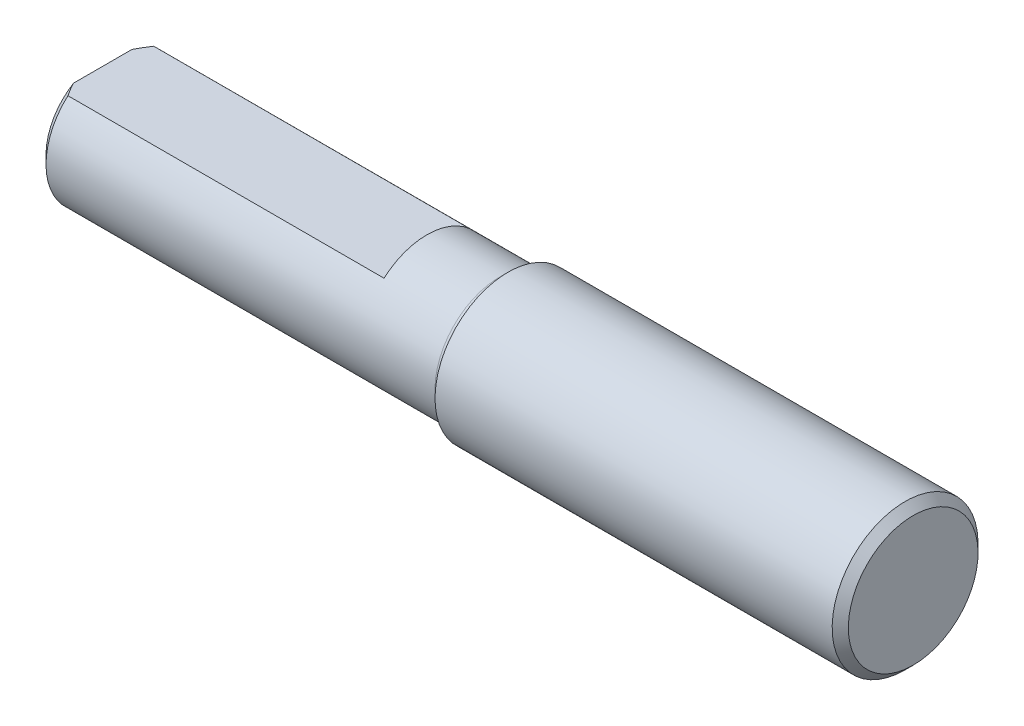
ISO-10303-21;
HEADER;
FILE_DESCRIPTION(('STEP AP214'),'2;1');
FILE_NAME('part.step','',(''),(''),'','','');
FILE_SCHEMA(('AUTOMOTIVE_DESIGN { 1 0 10303 214 1 1 1 1 }'));
ENDSEC;
DATA;
#1=APPLICATION_CONTEXT('core data for automotive mechanical design processes');
#2=APPLICATION_PROTOCOL_DEFINITION('international standard','automotive_design',2000,#1);
#3=PRODUCT_CONTEXT('',#1,'mechanical');
#4=PRODUCT('Part','Part','',(#3));
#5=PRODUCT_RELATED_PRODUCT_CATEGORY('part','',(#4));
#6=PRODUCT_DEFINITION_FORMATION('','',#4);
#7=PRODUCT_DEFINITION_CONTEXT('part definition',#1,'design');
#8=PRODUCT_DEFINITION('design','',#6,#7);
#9=PRODUCT_DEFINITION_SHAPE('','',#8);
#10=(LENGTH_UNIT() NAMED_UNIT(*) SI_UNIT(.MILLI.,.METRE.));
#11=(NAMED_UNIT(*) PLANE_ANGLE_UNIT() SI_UNIT($,.RADIAN.));
#12=(NAMED_UNIT(*) SI_UNIT($,.STERADIAN.) SOLID_ANGLE_UNIT());
#13=UNCERTAINTY_MEASURE_WITH_UNIT(LENGTH_MEASURE(1.E-05),#10,'distance_accuracy_value','');
#14=(GEOMETRIC_REPRESENTATION_CONTEXT(3) GLOBAL_UNCERTAINTY_ASSIGNED_CONTEXT((#13)) GLOBAL_UNIT_ASSIGNED_CONTEXT((#10,
#11,#12)) REPRESENTATION_CONTEXT('',''));
#15=CARTESIAN_POINT('',(0.,0.,0.));
#16=DIRECTION('',(0.,0.,1.));
#17=DIRECTION('',(1.,0.,0.));
#18=AXIS2_PLACEMENT_3D('',#15,#16,#17);
#19=CARTESIAN_POINT('',(-24.9999999999999,0.,0.));
#20=DIRECTION('',(0.999999999999998,0.,0.));
#21=DIRECTION('',(0.,1.,0.));
#22=AXIS2_PLACEMENT_3D('',#19,#20,#21);
#23=PLANE('',#22);
#24=CARTESIAN_POINT('',(-24.9999999999999,0.,0.));
#25=DIRECTION('',(-0.999999999999998,0.,0.));
#26=DIRECTION('',(0.,-1.,0.));
#27=AXIS2_PLACEMENT_3D('',#24,#25,#26);
#28=CIRCLE('',#27,3.50000000000006);
#29=CARTESIAN_POINT('',(-24.9999999999999,3.00000000000003,-1.80277563773157));
#30=VERTEX_POINT('',#29);
#31=CARTESIAN_POINT('',(-24.9999999999999,3.00000000000003,1.80277563773246));
#32=VERTEX_POINT('',#31);
#33=EDGE_CURVE('E86',#30,#32,#28,.T.);
#34=ORIENTED_EDGE('',*,*,#33,.T.);
#35=DIRECTION('',(0.,0.,0.999999999999998));
#36=VECTOR('',#35,1.);
#37=CARTESIAN_POINT('',(-24.9999999999999,3.00000000000003,-2.64575131106415));
#38=LINE('',#37,#36);
#39=EDGE_CURVE('E75',#30,#32,#38,.T.);
#40=ORIENTED_EDGE('',*,*,#39,.F.);
#41=EDGE_LOOP('',(#34,#40));
#42=FACE_BOUND('',#41,.T.);
#43=ADVANCED_FACE('F34',(#42),#23,.F.);
#44=CARTESIAN_POINT('',(24.9999999999992,0.,0.));
#45=DIRECTION('',(-0.999999999999998,0.,0.));
#46=DIRECTION('',(0.,-1.,0.));
#47=AXIS2_PLACEMENT_3D('',#44,#45,#46);
#48=PLANE('',#47);
#49=CARTESIAN_POINT('',(24.9999999999993,0.,0.));
#50=DIRECTION('',(-0.999999999999998,0.,0.));
#51=DIRECTION('',(0.,-1.,0.));
#52=AXIS2_PLACEMENT_3D('',#49,#50,#51);
#53=CIRCLE('',#52,4.00000000000017);
#54=CARTESIAN_POINT('',(24.9999999999993,-4.00000000000023,0.));
#55=VERTEX_POINT('',#54);
#56=EDGE_CURVE('E101',#55,#55,#53,.T.);
#57=ORIENTED_EDGE('',*,*,#56,.F.);
#58=EDGE_LOOP('',(#57));
#59=FACE_BOUND('',#58,.T.);
#60=ADVANCED_FACE('F111',(#59),#48,.F.);
#61=CARTESIAN_POINT('',(24.9999999999993,0.,0.));
#62=DIRECTION('',(-0.999999999999998,0.,0.));
#63=DIRECTION('',(0.,-1.,0.));
#64=AXIS2_PLACEMENT_3D('',#61,#62,#63);
#65=CONICAL_SURFACE('',#64,4.00000000000017,0.785398163397447);
#66=CARTESIAN_POINT('',(24.4999999999992,0.,0.));
#67=DIRECTION('',(-0.999999999999998,0.,0.));
#68=DIRECTION('',(0.,-1.,0.));
#69=AXIS2_PLACEMENT_3D('',#66,#67,#68);
#70=CIRCLE('',#69,4.50000000000023);
#71=CARTESIAN_POINT('',(24.4999999999992,-4.50000000000028,0.));
#72=VERTEX_POINT('',#71);
#73=EDGE_CURVE('E99',#72,#72,#70,.T.);
#74=CARTESIAN_POINT('',(24.4999999999992,-4.50000000000028,0.));
#75=CARTESIAN_POINT('',(24.5052083333326,-4.49479166666695,0.));
#76=CARTESIAN_POINT('',(24.5104166666659,-4.48958333333362,0.));
#77=CARTESIAN_POINT('',(24.5208333333326,-4.47916666666695,0.));
#78=CARTESIAN_POINT('',(24.5260416666659,-4.47395833333361,0.));
#79=CARTESIAN_POINT('',(24.5364583333326,-4.46354166666694,0.));
#80=CARTESIAN_POINT('',(24.5416666666659,-4.45833333333361,0.));
#81=CARTESIAN_POINT('',(24.5520833333326,-4.44791666666694,0.));
#82=CARTESIAN_POINT('',(24.5572916666659,-4.44270833333361,0.));
#83=CARTESIAN_POINT('',(24.5677083333326,-4.43229166666694,0.));
#84=CARTESIAN_POINT('',(24.5729166666659,-4.42708333333361,0.));
#85=CARTESIAN_POINT('',(24.5833333333326,-4.41666666666694,0.));
#86=CARTESIAN_POINT('',(24.5885416666659,-4.41145833333361,0.));
#87=CARTESIAN_POINT('',(24.5989583333326,-4.40104166666694,0.));
#88=CARTESIAN_POINT('',(24.6041666666659,-4.3958333333336,0.));
#89=CARTESIAN_POINT('',(24.6145833333326,-4.38541666666694,0.));
#90=CARTESIAN_POINT('',(24.6197916666659,-4.3802083333336,0.));
#91=CARTESIAN_POINT('',(24.6302083333326,-4.36979166666694,0.));
#92=CARTESIAN_POINT('',(24.6354166666659,-4.3645833333336,0.));
#93=CARTESIAN_POINT('',(24.6458333333326,-4.35416666666693,0.));
#94=CARTESIAN_POINT('',(24.6510416666659,-4.3489583333336,0.));
#95=CARTESIAN_POINT('',(24.6614583333326,-4.33854166666693,0.));
#96=CARTESIAN_POINT('',(24.6666666666659,-4.3333333333336,0.));
#97=CARTESIAN_POINT('',(24.6770833333326,-4.32291666666693,0.));
#98=CARTESIAN_POINT('',(24.6822916666659,-4.3177083333336,0.));
#99=CARTESIAN_POINT('',(24.6927083333326,-4.30729166666693,0.));
#100=CARTESIAN_POINT('',(24.6979166666659,-4.3020833333336,0.));
#101=CARTESIAN_POINT('',(24.7083333333326,-4.29166666666693,0.));
#102=CARTESIAN_POINT('',(24.7135416666659,-4.28645833333359,0.));
#103=CARTESIAN_POINT('',(24.7239583333326,-4.27604166666692,0.));
#104=CARTESIAN_POINT('',(24.7291666666659,-4.27083333333359,0.));
#105=CARTESIAN_POINT('',(24.7395833333326,-4.26041666666692,0.));
#106=CARTESIAN_POINT('',(24.7447916666659,-4.25520833333359,0.));
#107=CARTESIAN_POINT('',(24.7552083333326,-4.24479166666692,0.));
#108=CARTESIAN_POINT('',(24.7604166666659,-4.23958333333359,0.));
#109=CARTESIAN_POINT('',(24.7708333333326,-4.22916666666692,0.));
#110=CARTESIAN_POINT('',(24.7760416666659,-4.22395833333359,0.));
#111=CARTESIAN_POINT('',(24.7864583333326,-4.21354166666692,0.));
#112=CARTESIAN_POINT('',(24.7916666666659,-4.20833333333358,0.));
#113=CARTESIAN_POINT('',(24.8020833333326,-4.19791666666692,0.));
#114=CARTESIAN_POINT('',(24.8072916666659,-4.19270833333358,0.));
#115=CARTESIAN_POINT('',(24.8177083333326,-4.18229166666691,0.));
#116=CARTESIAN_POINT('',(24.8229166666659,-4.17708333333358,0.));
#117=CARTESIAN_POINT('',(24.8333333333326,-4.16666666666691,0.));
#118=CARTESIAN_POINT('',(24.8385416666659,-4.16145833333358,0.));
#119=CARTESIAN_POINT('',(24.8489583333326,-4.15104166666691,0.));
#120=CARTESIAN_POINT('',(24.8541666666659,-4.14583333333358,0.));
#121=CARTESIAN_POINT('',(24.8645833333326,-4.13541666666691,0.));
#122=CARTESIAN_POINT('',(24.8697916666659,-4.13020833333357,0.));
#123=CARTESIAN_POINT('',(24.8802083333326,-4.11979166666691,0.));
#124=CARTESIAN_POINT('',(24.8854166666659,-4.11458333333357,0.));
#125=CARTESIAN_POINT('',(24.8958333333326,-4.10416666666691,0.));
#126=CARTESIAN_POINT('',(24.9010416666659,-4.09895833333357,0.));
#127=CARTESIAN_POINT('',(24.9114583333326,-4.0885416666669,0.));
#128=CARTESIAN_POINT('',(24.9166666666659,-4.08333333333357,0.));
#129=CARTESIAN_POINT('',(24.9270833333326,-4.0729166666669,0.));
#130=CARTESIAN_POINT('',(24.9322916666659,-4.06770833333357,0.));
#131=CARTESIAN_POINT('',(24.9427083333326,-4.0572916666669,0.));
#132=CARTESIAN_POINT('',(24.9479166666659,-4.05208333333357,0.));
#133=CARTESIAN_POINT('',(24.9583333333326,-4.0416666666669,0.));
#134=CARTESIAN_POINT('',(24.9635416666659,-4.03645833333356,0.));
#135=CARTESIAN_POINT('',(24.9739583333326,-4.0260416666669,0.));
#136=CARTESIAN_POINT('',(24.9791666666659,-4.02083333333356,0.));
#137=CARTESIAN_POINT('',(24.9895833333326,-4.0104166666669,0.));
#138=CARTESIAN_POINT('',(24.9947916666659,-4.00520833333356,0.));
#139=CARTESIAN_POINT('',(24.9999999999993,-4.00000000000023,0.));
#140=B_SPLINE_CURVE_WITH_KNOTS('',3,(#74,#75,#76,#77,#78,#79,#80,#81,#82,#83,#84,#85,#86,#87,
#88,#89,#90,#91,#92,#93,#94,#95,#96,#97,#98,#99,#100,#101,#102,#103,#104,#105,#106,#107,#108,
#109,#110,#111,#112,#113,#114,#115,#116,#117,#118,#119,#120,#121,#122,#123,#124,#125,#126,#127,
#128,#129,#130,#131,#132,#133,#134,#135,#136,#137,#138,#139),.UNSPECIFIED.,.F.,.F.,(4,2,2,2,2,2,
2,2,2,2,2,2,2,2,2,2,2,2,2,2,2,2,2,2,2,2,2,2,2,2,2,2,4),(0.,0.0220970869120845,
0.0441941738241642,0.0662912607362487,0.0883883476483283,0.110485434560413,0.132582521472492,
0.154679608384577,0.176776695296656,0.198873782208741,0.22097086912082,0.243067956032905,
0.265165042944984,0.287262129857069,0.309359216769149,0.331456303681233,0.353553390593313,
0.375650477505395,0.397747564417477,0.419844651329561,0.441941738241641,0.464038825153723,
0.486135912065805,0.50823299897789,0.530330085889969,0.552427172802052,0.574524259714134,
0.596621346626218,0.618718433538298,0.64081552045038,0.662912607362462,0.685009694274547,
0.707106781186629),.UNSPECIFIED.);
#141=EDGE_CURVE('BSEAM115',#72,#55,#140,.T.);
#142=ORIENTED_EDGE('',*,*,#73,.F.);
#143=ORIENTED_EDGE('',*,*,#56,.T.);
#144=ORIENTED_EDGE('',*,*,#141,.T.);
#145=ORIENTED_EDGE('',*,*,#141,.F.);
#146=EDGE_LOOP('',(#142,#144,#143,#145));
#147=FACE_BOUND('',#146,.T.);
#148=ADVANCED_FACE('F115',(#147),#65,.T.);
#149=CARTESIAN_POINT('',(-24.9999999999999,0.,0.));
#150=DIRECTION('',(-0.999999999999998,0.,0.));
#151=DIRECTION('',(0.,-1.,0.));
#152=AXIS2_PLACEMENT_3D('',#149,#150,#151);
#153=CYLINDRICAL_SURFACE('',#152,4.50000000000021);
#154=CARTESIAN_POINT('',(1.11022302462516E-13,0.,0.));
#155=DIRECTION('',(-0.999999999999998,0.,0.));
#156=DIRECTION('',(0.,-1.,0.));
#157=AXIS2_PLACEMENT_3D('',#154,#155,#156);
#158=CIRCLE('',#157,4.5000000000002);
#159=CARTESIAN_POINT('',(1.04083408558608E-13,-4.50000000000024,0.));
#160=VERTEX_POINT('',#159);
#161=EDGE_CURVE('E96',#160,#160,#158,.T.);
#162=CARTESIAN_POINT('',(1.04083408558608E-13,-4.50000000000024,0.));
#163=CARTESIAN_POINT('',(0.255208333333429,-4.50000000000024,0.));
#164=CARTESIAN_POINT('',(0.510416666666754,-4.50000000000024,0.));
#165=CARTESIAN_POINT('',(1.0208333333334,-4.50000000000024,0.));
#166=CARTESIAN_POINT('',(1.27604166666673,-4.50000000000024,0.));
#167=CARTESIAN_POINT('',(1.78645833333337,-4.50000000000024,0.));
#168=CARTESIAN_POINT('',(2.0416666666667,-4.50000000000024,0.));
#169=CARTESIAN_POINT('',(2.55208333333335,-4.50000000000024,0.));
#170=CARTESIAN_POINT('',(2.80729166666667,-4.50000000000024,0.));
#171=CARTESIAN_POINT('',(3.31770833333332,-4.50000000000024,0.));
#172=CARTESIAN_POINT('',(3.57291666666664,-4.50000000000024,0.));
#173=CARTESIAN_POINT('',(4.08333333333329,-4.50000000000024,0.));
#174=CARTESIAN_POINT('',(4.33854166666661,-4.50000000000025,0.));
#175=CARTESIAN_POINT('',(4.84895833333326,-4.50000000000025,0.));
#176=CARTESIAN_POINT('',(5.10416666666659,-4.50000000000025,0.));
#177=CARTESIAN_POINT('',(5.61458333333323,-4.50000000000025,0.));
#178=CARTESIAN_POINT('',(5.86979166666656,-4.50000000000025,0.));
#179=CARTESIAN_POINT('',(6.38020833333321,-4.50000000000025,0.));
#180=CARTESIAN_POINT('',(6.63541666666653,-4.50000000000025,0.));
#181=CARTESIAN_POINT('',(7.14583333333318,-4.50000000000025,0.));
#182=CARTESIAN_POINT('',(7.40104166666651,-4.50000000000025,0.));
#183=CARTESIAN_POINT('',(7.91145833333315,-4.50000000000025,0.));
#184=CARTESIAN_POINT('',(8.16666666666648,-4.50000000000025,0.));
#185=CARTESIAN_POINT('',(8.67708333333312,-4.50000000000025,0.));
#186=CARTESIAN_POINT('',(8.93229166666644,-4.50000000000025,0.));
#187=CARTESIAN_POINT('',(9.44270833333309,-4.50000000000025,0.));
#188=CARTESIAN_POINT('',(9.69791666666642,-4.50000000000025,0.));
#189=CARTESIAN_POINT('',(10.2083333333331,-4.50000000000025,0.));
#190=CARTESIAN_POINT('',(10.4635416666664,-4.50000000000025,0.));
#191=CARTESIAN_POINT('',(10.973958333333,-4.50000000000025,0.));
#192=CARTESIAN_POINT('',(11.2291666666664,-4.50000000000025,0.));
#193=CARTESIAN_POINT('',(11.739583333333,-4.50000000000025,0.));
#194=CARTESIAN_POINT('',(11.9947916666663,-4.50000000000025,0.));
#195=CARTESIAN_POINT('',(12.505208333333,-4.50000000000025,0.));
#196=CARTESIAN_POINT('',(12.7604166666663,-4.50000000000025,0.));
#197=CARTESIAN_POINT('',(13.270833333333,-4.50000000000025,0.));
#198=CARTESIAN_POINT('',(13.5260416666663,-4.50000000000026,0.));
#199=CARTESIAN_POINT('',(14.0364583333329,-4.50000000000026,0.));
#200=CARTESIAN_POINT('',(14.2916666666663,-4.50000000000026,0.));
#201=CARTESIAN_POINT('',(14.8020833333329,-4.50000000000026,0.));
#202=CARTESIAN_POINT('',(15.0572916666662,-4.50000000000026,0.));
#203=CARTESIAN_POINT('',(15.5677083333329,-4.50000000000026,0.));
#204=CARTESIAN_POINT('',(15.8229166666662,-4.50000000000026,0.));
#205=CARTESIAN_POINT('',(16.3333333333328,-4.50000000000026,0.));
#206=CARTESIAN_POINT('',(16.5885416666662,-4.50000000000026,0.));
#207=CARTESIAN_POINT('',(17.0989583333328,-4.50000000000026,0.));
#208=CARTESIAN_POINT('',(17.3541666666661,-4.50000000000026,0.));
#209=CARTESIAN_POINT('',(17.8645833333328,-4.50000000000026,0.));
#210=CARTESIAN_POINT('',(18.1197916666661,-4.50000000000026,0.));
#211=CARTESIAN_POINT('',(18.6302083333328,-4.50000000000026,0.));
#212=CARTESIAN_POINT('',(18.8854166666661,-4.50000000000026,0.));
#213=CARTESIAN_POINT('',(19.3958333333327,-4.50000000000026,0.));
#214=CARTESIAN_POINT('',(19.6510416666661,-4.50000000000026,0.));
#215=CARTESIAN_POINT('',(20.1614583333327,-4.50000000000026,0.));
#216=CARTESIAN_POINT('',(20.416666666666,-4.50000000000026,0.));
#217=CARTESIAN_POINT('',(20.9270833333327,-4.50000000000026,0.));
#218=CARTESIAN_POINT('',(21.182291666666,-4.50000000000026,0.));
#219=CARTESIAN_POINT('',(21.6927083333327,-4.50000000000026,0.));
#220=CARTESIAN_POINT('',(21.947916666666,-4.50000000000026,0.));
#221=CARTESIAN_POINT('',(22.4583333333326,-4.50000000000026,0.));
#222=CARTESIAN_POINT('',(22.713541666666,-4.50000000000026,0.));
#223=CARTESIAN_POINT('',(23.2239583333326,-4.50000000000026,0.));
#224=CARTESIAN_POINT('',(23.4791666666659,-4.50000000000027,0.));
#225=CARTESIAN_POINT('',(23.9895833333326,-4.50000000000027,0.));
#226=CARTESIAN_POINT('',(24.2447916666659,-4.50000000000027,0.));
#227=CARTESIAN_POINT('',(24.4999999999992,-4.50000000000027,0.));
#228=B_SPLINE_CURVE_WITH_KNOTS('',3,(#162,#163,#164,#165,#166,#167,#168,#169,#170,#171,#172,
#173,#174,#175,#176,#177,#178,#179,#180,#181,#182,#183,#184,#185,#186,#187,#188,#189,#190,#191,
#192,#193,#194,#195,#196,#197,#198,#199,#200,#201,#202,#203,#204,#205,#206,#207,#208,#209,#210,
#211,#212,#213,#214,#215,#216,#217,#218,#219,#220,#221,#222,#223,#224,#225,#226,#227),
.UNSPECIFIED.,.F.,.F.,(4,2,2,2,2,2,2,2,2,2,2,2,2,2,2,2,2,2,2,2,2,2,2,2,2,2,2,2,2,2,2,2,4),(0.,
0.765624999999975,1.53124999999995,2.29687499999992,3.06249999999989,3.82812499999986,
4.59374999999983,5.35937499999981,6.12499999999978,6.89062499999975,7.65624999999973,
8.42187499999969,9.18749999999966,9.95312499999964,10.7187499999996,11.4843749999996,
12.2499999999996,13.0156249999995,13.7812499999995,14.5468749999995,15.3124999999995,
16.0781249999994,16.8437499999994,17.6093749999994,18.3749999999993,19.1406249999993,
19.9062499999993,20.6718749999993,21.4374999999992,22.2031249999992,22.9687499999992,
23.7343749999991,24.4999999999991),.UNSPECIFIED.);
#229=EDGE_CURVE('BSEAM120',#160,#72,#228,.T.);
#230=ORIENTED_EDGE('',*,*,#161,.F.);
#231=ORIENTED_EDGE('',*,*,#73,.T.);
#232=ORIENTED_EDGE('',*,*,#229,.T.);
#233=ORIENTED_EDGE('',*,*,#229,.F.);
#234=EDGE_LOOP('',(#230,#232,#231,#233));
#235=FACE_BOUND('',#234,.T.);
#236=ADVANCED_FACE('F120',(#235),#153,.T.);
#237=CARTESIAN_POINT('',(-0.499999999999612,0.,0.));
#238=DIRECTION('',(-0.999999999999998,0.,0.));
#239=DIRECTION('',(0.,-1.,0.));
#240=AXIS2_PLACEMENT_3D('',#237,#238,#239);
#241=TOROIDAL_SURFACE('',#240,4.49999999999961,0.499999999999542);
#242=CARTESIAN_POINT('',(-0.499999999999723,0.,0.));
#243=DIRECTION('',(-0.999999999999998,0.,0.));
#244=DIRECTION('',(0.,-1.,0.));
#245=AXIS2_PLACEMENT_3D('',#242,#243,#244);
#246=CIRCLE('',#245,4.00000000000007);
#247=CARTESIAN_POINT('',(-0.499999999999727,-4.0000000000001,0.));
#248=VERTEX_POINT('',#247);
#249=EDGE_CURVE('E93',#248,#248,#246,.T.);
#250=ORIENTED_EDGE('',*,*,#249,.F.);
#251=EDGE_LOOP('',(#250));
#252=FACE_BOUND('',#251,.T.);
#253=ORIENTED_EDGE('',*,*,#161,.T.);
#254=EDGE_LOOP('',(#253));
#255=FACE_BOUND('',#254,.T.);
#256=ADVANCED_FACE('F126',(#252,#255),#241,.F.);
#257=CARTESIAN_POINT('',(-24.9999999999999,0.,0.));
#258=DIRECTION('',(-0.999999999999998,0.,0.));
#259=DIRECTION('',(0.,-1.,0.));
#260=AXIS2_PLACEMENT_3D('',#257,#258,#259);
#261=CYLINDRICAL_SURFACE('',#260,4.00000000000004);
#262=CARTESIAN_POINT('',(-4.99999999999989,0.,0.));
#263=DIRECTION('',(-0.999999999999998,0.,0.));
#264=DIRECTION('',(0.,-1.,0.));
#265=AXIS2_PLACEMENT_3D('',#262,#263,#264);
#266=CIRCLE('',#265,3.99999999999998);
#267=CARTESIAN_POINT('',(-4.99999999999991,3.00000000000001,2.64575131106459));
#268=VERTEX_POINT('',#267);
#269=CARTESIAN_POINT('',(-4.99999999999991,3.00000000000001,-2.64575131106415));
#270=VERTEX_POINT('',#269);
#271=EDGE_CURVE('E71',#268,#270,#266,.T.);
#272=ORIENTED_EDGE('',*,*,#271,.F.);
#273=DIRECTION('',(-0.999999999999998,0.,0.));
#274=VECTOR('',#273,1.);
#275=CARTESIAN_POINT('',(-4.99999999999991,3.00000000000001,2.64575131106459));
#276=LINE('',#275,#274);
#277=CARTESIAN_POINT('',(-24.4999999999997,3.00000000000003,2.64575131106459));
#278=VERTEX_POINT('',#277);
#279=EDGE_CURVE('E78',#268,#278,#276,.T.);
#280=ORIENTED_EDGE('',*,*,#279,.T.);
#281=CARTESIAN_POINT('',(-24.4999999999997,0.,0.));
#282=DIRECTION('',(-0.999999999999998,0.,0.));
#283=DIRECTION('',(0.,-1.,0.));
#284=AXIS2_PLACEMENT_3D('',#281,#282,#283);
#285=CIRCLE('',#284,4.);
#286=CARTESIAN_POINT('',(-24.4999999999997,3.00000000000003,-2.64575131106415));
#287=VERTEX_POINT('',#286);
#288=EDGE_CURVE('E84',#287,#278,#285,.T.);
#289=ORIENTED_EDGE('',*,*,#288,.F.);
#290=DIRECTION('',(-0.999999999999998,0.,0.));
#291=VECTOR('',#290,1.);
#292=CARTESIAN_POINT('',(-4.99999999999991,3.00000000000001,-2.64575131106415));
#293=LINE('',#292,#291);
#294=EDGE_CURVE('E53',#270,#287,#293,.T.);
#295=ORIENTED_EDGE('',*,*,#294,.F.);
#296=EDGE_LOOP('',(#272,#280,#289,#295));
#297=FACE_BOUND('',#296,.T.);
#298=ORIENTED_EDGE('',*,*,#249,.T.);
#299=EDGE_LOOP('',(#298));
#300=FACE_BOUND('',#299,.T.);
#301=ADVANCED_FACE('F81',(#297,#300),#261,.T.);
#302=CARTESIAN_POINT('',(-24.4999999999997,0.,0.));
#303=DIRECTION('',(0.999999999999998,0.,0.));
#304=DIRECTION('',(0.,1.,0.));
#305=AXIS2_PLACEMENT_3D('',#302,#303,#304);
#306=CONICAL_SURFACE('',#305,4.,0.785398163397227);
#307=ORIENTED_EDGE('',*,*,#288,.T.);
#308=CARTESIAN_POINT('',(-21.9389659892247,3.00000000000002,5.83499505488538));
#309=CARTESIAN_POINT('',(-22.0903757892768,3.00000000000002,5.66468696293585));
#310=CARTESIAN_POINT('',(-22.2410727937851,3.00000000000002,5.49373335194589));
#311=CARTESIAN_POINT('',(-22.5405200919097,3.00000000000002,5.15001939532114));
#312=CARTESIAN_POINT('',(-22.6892696392174,3.00000000000002,4.97725840019569));
#313=CARTESIAN_POINT('',(-22.9861622529166,3.00000000000003,4.62721157591021));
#314=CARTESIAN_POINT('',(-23.1342705110427,3.00000000000003,4.44989613430255));
#315=CARTESIAN_POINT('',(-23.4268634474958,3.00000000000002,4.09234737889281));
#316=CARTESIAN_POINT('',(-23.5713488711189,3.00000000000001,3.9121146779992));
#317=CARTESIAN_POINT('',(-23.848485578707,3.00000000000001,3.55645961437265));
#318=CARTESIAN_POINT('',(-23.9813720744665,3.00000000000002,3.38122119667286));
#319=CARTESIAN_POINT('',(-24.2407715989189,3.00000000000003,3.02586564459339));
#320=CARTESIAN_POINT('',(-24.367280814457,3.00000000000003,2.84574568808456));
#321=CARTESIAN_POINT('',(-24.5496072378903,3.00000000000003,2.57103616471239));
#322=CARTESIAN_POINT('',(-24.6090558718556,3.00000000000003,2.4788592059635));
#323=CARTESIAN_POINT('',(-24.7249614937987,3.00000000000003,2.29264891488516));
#324=CARTESIAN_POINT('',(-24.7814188465766,3.00000000000003,2.1986158108496));
#325=CARTESIAN_POINT('',(-24.8905659215351,3.00000000000003,2.00849807496143));
#326=CARTESIAN_POINT('',(-24.9432592711017,3.00000000000003,1.91241553739272));
#327=CARTESIAN_POINT('',(-25.043980962702,3.00000000000003,1.71784609768047));
#328=CARTESIAN_POINT('',(-25.0920104978542,3.00000000000003,1.61935981858356));
#329=CARTESIAN_POINT('',(-25.1790019774935,3.00000000000003,1.42683682628257));
#330=CARTESIAN_POINT('',(-25.2183662352772,3.00000000000003,1.33298336568668));
#331=CARTESIAN_POINT('',(-25.2908795476152,3.00000000000003,1.14287816274652));
#332=CARTESIAN_POINT('',(-25.3240286409686,3.00000000000003,1.04662643537812));
#333=CARTESIAN_POINT('',(-25.3826486518212,3.00000000000003,0.852297204493808));
#334=CARTESIAN_POINT('',(-25.4081565505998,3.00000000000003,0.754231016372685));
#335=CARTESIAN_POINT('',(-25.4504005055913,3.00000000000003,0.556235100211649));
#336=CARTESIAN_POINT('',(-25.4671399623641,3.00000000000003,0.456306110193535));
#337=CARTESIAN_POINT('',(-25.4909810916825,3.00000000000003,0.253836760287375));
#338=CARTESIAN_POINT('',(-25.4979421404768,3.00000000000003,0.15127947755912));
#339=CARTESIAN_POINT('',(-25.5012693591199,3.00000000000003,-0.0540034437542772));
#340=CARTESIAN_POINT('',(-25.4976361757776,3.00000000000003,-0.156729071678753));
#341=CARTESIAN_POINT('',(-25.4800191738947,3.00000000000003,-0.361571241378228));
#342=CARTESIAN_POINT('',(-25.4660054383061,3.00000000000003,-0.463685160952634));
#343=CARTESIAN_POINT('',(-25.4285425687726,3.00000000000003,-0.666157326790062));
#344=CARTESIAN_POINT('',(-25.4050908667986,3.00000000000003,-0.766515087448418));
#345=CARTESIAN_POINT('',(-25.3403413656707,3.00000000000003,-1.00005180664666));
#346=CARTESIAN_POINT('',(-25.2956653952469,3.00000000000003,-1.13228749499477));
#347=CARTESIAN_POINT('',(-25.1948443980091,3.00000000000003,-1.39228431190255));
#348=CARTESIAN_POINT('',(-25.1386922182735,3.00000000000003,-1.52004259130819));
#349=CARTESIAN_POINT('',(-25.0172159775876,3.00000000000003,-1.77261496697955));
#350=CARTESIAN_POINT('',(-24.9518071340167,3.00000000000003,-1.89738774367353));
#351=CARTESIAN_POINT('',(-24.8144916763583,3.00000000000003,-2.14321034752287));
#352=CARTESIAN_POINT('',(-24.7425870831027,3.00000000000003,-2.26426131693418));
#353=CARTESIAN_POINT('',(-24.5684288351213,3.00000000000003,-2.54422316055349));
#354=CARTESIAN_POINT('',(-24.4642131606512,3.00000000000003,-2.70190655762437));
#355=CARTESIAN_POINT('',(-24.2496151327747,3.00000000000003,-3.01304239671675));
#356=CARTESIAN_POINT('',(-24.1392308523006,3.00000000000003,-3.16649349395757));
#357=CARTESIAN_POINT('',(-23.9138517191562,3.00000000000003,-3.47032287127962));
#358=CARTESIAN_POINT('',(-23.7988500139087,3.00000000000003,-3.620696043603));
#359=CARTESIAN_POINT('',(-23.5655436104468,3.00000000000003,-3.91886032458168));
#360=CARTESIAN_POINT('',(-23.4472387225664,3.00000000000003,-4.0666512841731));
#361=CARTESIAN_POINT('',(-23.2150876682182,3.00000000000003,-4.35163366035396));
#362=CARTESIAN_POINT('',(-23.1013833244633,3.00000000000003,-4.48894094594994));
#363=CARTESIAN_POINT('',(-22.8722156383547,3.00000000000003,-4.76208709604349));
#364=CARTESIAN_POINT('',(-22.7567522215574,3.00000000000003,-4.89792589797682));
#365=CARTESIAN_POINT('',(-22.5248722727418,3.00000000000003,-5.1678738455306));
#366=CARTESIAN_POINT('',(-22.408461152582,3.00000000000002,-5.30198764827818));
#367=CARTESIAN_POINT('',(-22.1745050551923,3.00000000000003,-5.56920033722459));
#368=CARTESIAN_POINT('',(-22.0569601884371,3.00000000000003,-5.7022993200913));
#369=CARTESIAN_POINT('',(-21.9389659892247,3.00000000000003,-5.8349950548845));
#370=B_SPLINE_CURVE_WITH_KNOTS('',3,(#308,#309,#310,#311,#312,#313,#314,#315,#316,#317,#318,
#319,#320,#321,#322,#323,#324,#325,#326,#327,#328,#329,#330,#331,#332,#333,#334,#335,#336,#337,
#338,#339,#340,#341,#342,#343,#344,#345,#346,#347,#348,#349,#350,#351,#352,#353,#354,#355,#356,
#357,#358,#359,#360,#361,#362,#363,#364,#365,#366,#367,#368,#369),.UNSPECIFIED.,.F.,.F.,(4,2,2,
2,2,2,2,2,2,2,2,2,2,2,2,2,2,2,2,2,2,2,2,2,2,2,2,2,2,2,4),(0.,0.683654507752578,1.36756375940572,
2.06063321783412,2.75355890710629,3.41324718742713,4.07332534564684,4.40233598102933,
4.73130639930278,5.05995538641276,5.38852007430314,5.69366382176895,5.99880566425675,
6.30244591525327,6.60596832173556,6.91381250668759,7.22163789724102,7.53035391807945,
7.83915399604452,8.25715240118056,8.67541213636147,9.09778590260833,9.52002871766469,
10.086837759129,10.6538248720767,11.221687015142,11.7895818316978,12.3243890194937,
12.8592189034716,13.3919807283708,13.9246911539617),.UNSPECIFIED.);
#371=EDGE_CURVE('E11',#278,#32,#370,.T.);
#372=ORIENTED_EDGE('',*,*,#371,.T.);
#373=ORIENTED_EDGE('',*,*,#33,.F.);
#374=EDGE_CURVE('E37',#30,#287,#370,.T.);
#375=ORIENTED_EDGE('',*,*,#374,.T.);
#376=EDGE_LOOP('',(#307,#372,#373,#375));
#377=FACE_BOUND('',#376,.T.);
#378=ADVANCED_FACE('F107',(#377),#306,.T.);
#379=CARTESIAN_POINT('',(-4.99999999999991,3.00000000000001,-2.64575131106415));
#380=DIRECTION('',(0.,-1.,0.));
#381=DIRECTION('',(0.999999999999998,0.,0.));
#382=AXIS2_PLACEMENT_3D('',#379,#380,#381);
#383=PLANE('',#382);
#384=ORIENTED_EDGE('',*,*,#279,.F.);
#385=DIRECTION('',(0.,0.,0.999999999999998));
#386=VECTOR('',#385,1.);
#387=CARTESIAN_POINT('',(-4.99999999999991,3.00000000000001,-2.64575131106415));
#388=LINE('',#387,#386);
#389=EDGE_CURVE('E73',#270,#268,#388,.T.);
#390=ORIENTED_EDGE('',*,*,#389,.F.);
#391=ORIENTED_EDGE('',*,*,#294,.T.);
#392=ORIENTED_EDGE('',*,*,#374,.F.);
#393=ORIENTED_EDGE('',*,*,#39,.T.);
#394=ORIENTED_EDGE('',*,*,#371,.F.);
#395=EDGE_LOOP('',(#384,#390,#391,#392,#393,#394));
#396=FACE_BOUND('',#395,.T.);
#397=ADVANCED_FACE('F77',(#396),#383,.F.);
#398=CARTESIAN_POINT('',(-4.99999999999989,0.,0.));
#399=DIRECTION('',(-0.999999999999998,0.,0.));
#400=DIRECTION('',(0.,-1.,0.));
#401=AXIS2_PLACEMENT_3D('',#398,#399,#400);
#402=PLANE('',#401);
#403=ORIENTED_EDGE('',*,*,#271,.T.);
#404=ORIENTED_EDGE('',*,*,#389,.T.);
#405=EDGE_LOOP('',(#403,#404));
#406=FACE_BOUND('',#405,.T.);
#407=ADVANCED_FACE('F72',(#406),#402,.T.);
#408=CLOSED_SHELL('',(#43,#60,#148,#236,#256,#301,#378,#397,#407));
#409=MANIFOLD_SOLID_BREP('B2',#408);
#410=ADVANCED_BREP_SHAPE_REPRESENTATION('',(#18,#409),#14);
#411=SHAPE_DEFINITION_REPRESENTATION(#9,#410);
ENDSEC;
END-ISO-10303-21;
